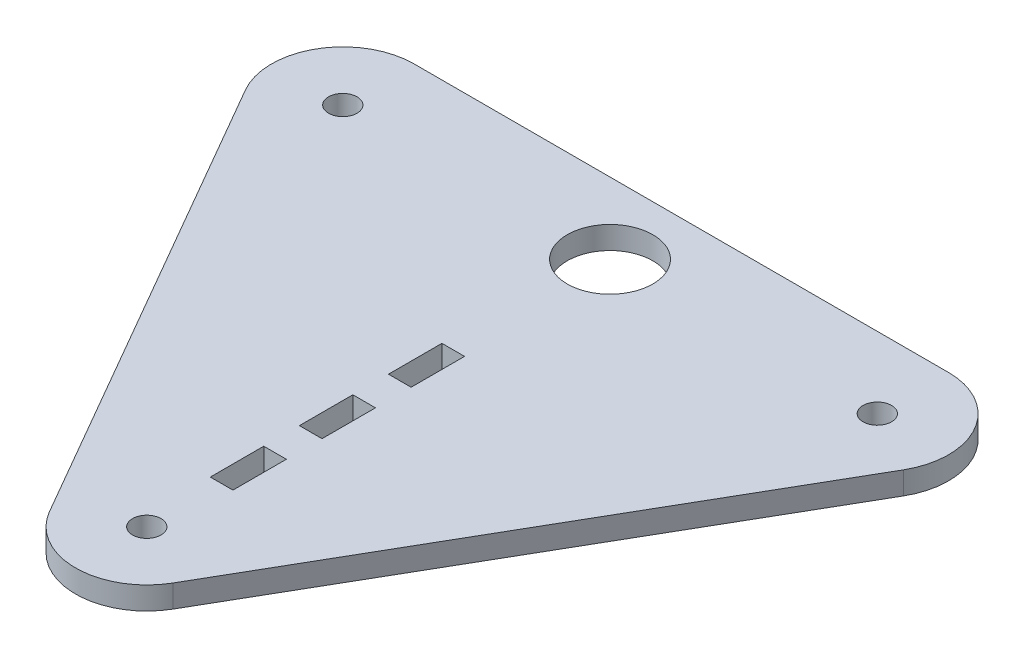
ISO-10303-21;
HEADER;
FILE_DESCRIPTION(('STEP AP214'),'2;1');
FILE_NAME('part.step','',(''),(''),'','','');
FILE_SCHEMA(('AUTOMOTIVE_DESIGN { 1 0 10303 214 1 1 1 1 }'));
ENDSEC;
DATA;
#1=APPLICATION_CONTEXT('core data for automotive mechanical design processes');
#2=APPLICATION_PROTOCOL_DEFINITION('international standard','automotive_design',2000,#1);
#3=PRODUCT_CONTEXT('',#1,'mechanical');
#4=PRODUCT('Part','Part','',(#3));
#5=PRODUCT_RELATED_PRODUCT_CATEGORY('part','',(#4));
#6=PRODUCT_DEFINITION_FORMATION('','',#4);
#7=PRODUCT_DEFINITION_CONTEXT('part definition',#1,'design');
#8=PRODUCT_DEFINITION('design','',#6,#7);
#9=PRODUCT_DEFINITION_SHAPE('','',#8);
#10=(LENGTH_UNIT() NAMED_UNIT(*) SI_UNIT(.MILLI.,.METRE.));
#11=(NAMED_UNIT(*) PLANE_ANGLE_UNIT() SI_UNIT($,.RADIAN.));
#12=(NAMED_UNIT(*) SI_UNIT($,.STERADIAN.) SOLID_ANGLE_UNIT());
#13=UNCERTAINTY_MEASURE_WITH_UNIT(LENGTH_MEASURE(1.E-05),#10,'distance_accuracy_value','');
#14=(GEOMETRIC_REPRESENTATION_CONTEXT(3) GLOBAL_UNCERTAINTY_ASSIGNED_CONTEXT((#13)) GLOBAL_UNIT_ASSIGNED_CONTEXT((#10,
#11,#12)) REPRESENTATION_CONTEXT('',''));
#15=CARTESIAN_POINT('',(0.,0.,0.));
#16=DIRECTION('',(0.,0.,1.));
#17=DIRECTION('',(1.,0.,0.));
#18=AXIS2_PLACEMENT_3D('',#15,#16,#17);
#19=CARTESIAN_POINT('',(75.,6.35,-65.));
#20=DIRECTION('',(0.,1.,0.));
#21=DIRECTION('',(0.,0.,1.));
#22=AXIS2_PLACEMENT_3D('',#19,#20,#21);
#23=PLANE('',#22);
#24=CARTESIAN_POINT('',(0.,6.35,-65.));
#25=DIRECTION('',(0.,1.,0.));
#26=DIRECTION('',(0.,0.,1.));
#27=AXIS2_PLACEMENT_3D('',#24,#25,#26);
#28=CIRCLE('',#27,12.);
#29=CARTESIAN_POINT('',(0.,6.35,-53.));
#30=VERTEX_POINT('',#29);
#31=EDGE_CURVE('E250',#30,#30,#28,.T.);
#32=ORIENTED_EDGE('',*,*,#31,.F.);
#33=EDGE_LOOP('',(#32));
#34=FACE_BOUND('',#33,.T.);
#35=DIRECTION('',(0.,0.,-1.));
#36=VECTOR('',#35,1.);
#37=CARTESIAN_POINT('',(3.175,6.35,29.));
#38=LINE('',#37,#36);
#39=CARTESIAN_POINT('',(3.175,6.35,44.));
#40=VERTEX_POINT('',#39);
#41=CARTESIAN_POINT('',(3.175,6.35,29.));
#42=VERTEX_POINT('',#41);
#43=EDGE_CURVE('E114',#40,#42,#38,.T.);
#44=ORIENTED_EDGE('',*,*,#43,.F.);
#45=DIRECTION('',(1.,0.,0.));
#46=VECTOR('',#45,1.);
#47=CARTESIAN_POINT('',(-3.17499999999999,6.35,44.));
#48=LINE('',#47,#46);
#49=CARTESIAN_POINT('',(-3.17499999999999,6.35,44.));
#50=VERTEX_POINT('',#49);
#51=EDGE_CURVE('E271',#50,#40,#48,.T.);
#52=ORIENTED_EDGE('',*,*,#51,.F.);
#53=DIRECTION('',(0.,0.,1.));
#54=VECTOR('',#53,1.);
#55=CARTESIAN_POINT('',(-3.175,6.35,29.));
#56=LINE('',#55,#54);
#57=CARTESIAN_POINT('',(-3.175,6.35,29.));
#58=VERTEX_POINT('',#57);
#59=EDGE_CURVE('E286',#58,#50,#56,.T.);
#60=ORIENTED_EDGE('',*,*,#59,.F.);
#61=DIRECTION('',(-1.,0.,0.));
#62=VECTOR('',#61,1.);
#63=CARTESIAN_POINT('',(-3.175,6.35,29.));
#64=LINE('',#63,#62);
#65=EDGE_CURVE('E282',#42,#58,#64,.T.);
#66=ORIENTED_EDGE('',*,*,#65,.F.);
#67=EDGE_LOOP('',(#44,#52,#60,#66));
#68=FACE_BOUND('',#67,.T.);
#69=DIRECTION('',(0.,0.,1.));
#70=VECTOR('',#69,1.);
#71=CARTESIAN_POINT('',(-3.175,6.35,-21.));
#72=LINE('',#71,#70);
#73=CARTESIAN_POINT('',(-3.175,6.35,-21.));
#74=VERTEX_POINT('',#73);
#75=CARTESIAN_POINT('',(-3.175,6.35,-6.00000000000001));
#76=VERTEX_POINT('',#75);
#77=EDGE_CURVE('E122',#74,#76,#72,.T.);
#78=ORIENTED_EDGE('',*,*,#77,.F.);
#79=DIRECTION('',(-1.,0.,0.));
#80=VECTOR('',#79,1.);
#81=CARTESIAN_POINT('',(3.175,6.35,-21.));
#82=LINE('',#81,#80);
#83=CARTESIAN_POINT('',(3.175,6.35,-21.));
#84=VERTEX_POINT('',#83);
#85=EDGE_CURVE('E244',#84,#74,#82,.T.);
#86=ORIENTED_EDGE('',*,*,#85,.F.);
#87=DIRECTION('',(0.,0.,-1.));
#88=VECTOR('',#87,1.);
#89=CARTESIAN_POINT('',(3.175,6.35,-21.));
#90=LINE('',#89,#88);
#91=CARTESIAN_POINT('',(3.175,6.35,-6.));
#92=VERTEX_POINT('',#91);
#93=EDGE_CURVE('E247',#92,#84,#90,.T.);
#94=ORIENTED_EDGE('',*,*,#93,.F.);
#95=DIRECTION('',(1.,0.,0.));
#96=VECTOR('',#95,1.);
#97=CARTESIAN_POINT('',(3.175,6.35,-6.));
#98=LINE('',#97,#96);
#99=EDGE_CURVE('E256',#76,#92,#98,.T.);
#100=ORIENTED_EDGE('',*,*,#99,.F.);
#101=EDGE_LOOP('',(#78,#86,#94,#100));
#102=FACE_BOUND('',#101,.T.);
#103=DIRECTION('',(0.,0.,-1.));
#104=VECTOR('',#103,1.);
#105=CARTESIAN_POINT('',(3.175,6.35,4.));
#106=LINE('',#105,#104);
#107=CARTESIAN_POINT('',(3.175,6.35,19.));
#108=VERTEX_POINT('',#107);
#109=CARTESIAN_POINT('',(3.175,6.35,4.));
#110=VERTEX_POINT('',#109);
#111=EDGE_CURVE('E263',#108,#110,#106,.T.);
#112=ORIENTED_EDGE('',*,*,#111,.F.);
#113=DIRECTION('',(1.,0.,0.));
#114=VECTOR('',#113,1.);
#115=CARTESIAN_POINT('',(-3.175,6.35,19.));
#116=LINE('',#115,#114);
#117=CARTESIAN_POINT('',(-3.175,6.35,19.));
#118=VERTEX_POINT('',#117);
#119=EDGE_CURVE('E301',#118,#108,#116,.T.);
#120=ORIENTED_EDGE('',*,*,#119,.F.);
#121=DIRECTION('',(0.,0.,1.));
#122=VECTOR('',#121,1.);
#123=CARTESIAN_POINT('',(-3.175,6.35,4.));
#124=LINE('',#123,#122);
#125=CARTESIAN_POINT('',(-3.175,6.35,4.));
#126=VERTEX_POINT('',#125);
#127=EDGE_CURVE('E315',#126,#118,#124,.T.);
#128=ORIENTED_EDGE('',*,*,#127,.F.);
#129=DIRECTION('',(-1.,0.,0.));
#130=VECTOR('',#129,1.);
#131=CARTESIAN_POINT('',(-3.175,6.35,4.));
#132=LINE('',#131,#130);
#133=EDGE_CURVE('E312',#110,#126,#132,.T.);
#134=ORIENTED_EDGE('',*,*,#133,.F.);
#135=EDGE_LOOP('',(#112,#120,#128,#134));
#136=FACE_BOUND('',#135,.T.);
#137=CARTESIAN_POINT('',(75.,6.35,-65.));
#138=DIRECTION('',(0.,1.,0.));
#139=DIRECTION('',(0.,0.,1.));
#140=AXIS2_PLACEMENT_3D('',#137,#138,#139);
#141=CIRCLE('',#140,4.00000000000001);
#142=CARTESIAN_POINT('',(75.,6.35,-61.));
#143=VERTEX_POINT('',#142);
#144=EDGE_CURVE('E335',#143,#143,#141,.T.);
#145=ORIENTED_EDGE('',*,*,#144,.F.);
#146=EDGE_LOOP('',(#145));
#147=FACE_BOUND('',#146,.T.);
#148=CARTESIAN_POINT('',(75.,6.35,-65.));
#149=DIRECTION('',(0.,1.,0.));
#150=DIRECTION('',(0.,0.,1.));
#151=AXIS2_PLACEMENT_3D('',#148,#149,#150);
#152=CIRCLE('',#151,20.);
#153=CARTESIAN_POINT('',(92.323711720972,6.35,-55.0055509302085));
#154=VERTEX_POINT('',#153);
#155=CARTESIAN_POINT('',(75.,6.35,-85.));
#156=VERTEX_POINT('',#155);
#157=EDGE_CURVE('E347',#154,#156,#152,.T.);
#158=ORIENTED_EDGE('',*,*,#157,.T.);
#159=DIRECTION('',(1.,0.,0.));
#160=VECTOR('',#159,1.);
#161=CARTESIAN_POINT('',(-75.,6.35,-85.));
#162=LINE('',#161,#160);
#163=CARTESIAN_POINT('',(-75.,6.35,-85.));
#164=VERTEX_POINT('',#163);
#165=EDGE_CURVE('E349',#164,#156,#162,.T.);
#166=ORIENTED_EDGE('',*,*,#165,.F.);
#167=CARTESIAN_POINT('',(-75.,6.35,-65.));
#168=DIRECTION('',(0.,1.,0.));
#169=DIRECTION('',(0.,0.,1.));
#170=AXIS2_PLACEMENT_3D('',#167,#168,#169);
#171=CIRCLE('',#170,20.);
#172=CARTESIAN_POINT('',(-92.323711720972,6.35,-55.0055509302085));
#173=VERTEX_POINT('',#172);
#174=EDGE_CURVE('E353',#164,#173,#171,.T.);
#175=ORIENTED_EDGE('',*,*,#174,.T.);
#176=DIRECTION('',(0.499722453489577,0.,0.8661855860486));
#177=VECTOR('',#176,1.);
#178=CARTESIAN_POINT('',(-92.323711720972,6.35,-55.0055509302085));
#179=LINE('',#178,#177);
#180=CARTESIAN_POINT('',(-17.323711720972,6.35,74.9944490697916));
#181=VERTEX_POINT('',#180);
#182=EDGE_CURVE('E355',#173,#181,#179,.T.);
#183=ORIENTED_EDGE('',*,*,#182,.T.);
#184=CARTESIAN_POINT('',(0.,6.35,65.));
#185=DIRECTION('',(0.,1.,0.));
#186=DIRECTION('',(0.,0.,1.));
#187=AXIS2_PLACEMENT_3D('',#184,#185,#186);
#188=CIRCLE('',#187,20.);
#189=CARTESIAN_POINT('',(17.323711720972,6.35,74.9944490697916));
#190=VERTEX_POINT('',#189);
#191=EDGE_CURVE('E357',#181,#190,#188,.T.);
#192=ORIENTED_EDGE('',*,*,#191,.T.);
#193=DIRECTION('',(-0.499722453489577,0.,0.8661855860486));
#194=VECTOR('',#193,1.);
#195=CARTESIAN_POINT('',(92.323711720972,6.35,-55.0055509302085));
#196=LINE('',#195,#194);
#197=EDGE_CURVE('E359',#154,#190,#196,.T.);
#198=ORIENTED_EDGE('',*,*,#197,.F.);
#199=EDGE_LOOP('',(#158,#166,#175,#183,#192,#198));
#200=FACE_BOUND('',#199,.T.);
#201=CARTESIAN_POINT('',(0.,6.35,65.));
#202=DIRECTION('',(0.,1.,0.));
#203=DIRECTION('',(0.,0.,1.));
#204=AXIS2_PLACEMENT_3D('',#201,#202,#203);
#205=CIRCLE('',#204,4.);
#206=CARTESIAN_POINT('',(0.,6.35,69.));
#207=VERTEX_POINT('',#206);
#208=EDGE_CURVE('E341',#207,#207,#205,.T.);
#209=ORIENTED_EDGE('',*,*,#208,.F.);
#210=EDGE_LOOP('',(#209));
#211=FACE_BOUND('',#210,.T.);
#212=CARTESIAN_POINT('',(-75.,6.35,-65.));
#213=DIRECTION('',(0.,1.,0.));
#214=DIRECTION('',(0.,0.,1.));
#215=AXIS2_PLACEMENT_3D('',#212,#213,#214);
#216=CIRCLE('',#215,4.00000000000001);
#217=CARTESIAN_POINT('',(-75.,6.35,-61.));
#218=VERTEX_POINT('',#217);
#219=EDGE_CURVE('E329',#218,#218,#216,.T.);
#220=ORIENTED_EDGE('',*,*,#219,.F.);
#221=EDGE_LOOP('',(#220));
#222=FACE_BOUND('',#221,.T.);
#223=ADVANCED_FACE('F99',(#34,#68,#102,#136,#147,#200,#211,#222),#23,.T.);
#224=CARTESIAN_POINT('',(75.,0.,-65.));
#225=DIRECTION('',(0.,1.,0.));
#226=DIRECTION('',(0.,0.,1.));
#227=AXIS2_PLACEMENT_3D('',#224,#225,#226);
#228=PLANE('',#227);
#229=CARTESIAN_POINT('',(0.,0.,-65.));
#230=DIRECTION('',(0.,1.,0.));
#231=DIRECTION('',(0.,0.,1.));
#232=AXIS2_PLACEMENT_3D('',#229,#230,#231);
#233=CIRCLE('',#232,12.);
#234=CARTESIAN_POINT('',(0.,0.,-53.));
#235=VERTEX_POINT('',#234);
#236=EDGE_CURVE('E283',#235,#235,#233,.T.);
#237=ORIENTED_EDGE('',*,*,#236,.T.);
#238=EDGE_LOOP('',(#237));
#239=FACE_BOUND('',#238,.T.);
#240=DIRECTION('',(1.,0.,0.));
#241=VECTOR('',#240,1.);
#242=CARTESIAN_POINT('',(-3.17499999999999,0.,44.));
#243=LINE('',#242,#241);
#244=CARTESIAN_POINT('',(-3.17499999999999,0.,44.));
#245=VERTEX_POINT('',#244);
#246=CARTESIAN_POINT('',(3.175,0.,44.));
#247=VERTEX_POINT('',#246);
#248=EDGE_CURVE('E277',#245,#247,#243,.T.);
#249=ORIENTED_EDGE('',*,*,#248,.T.);
#250=DIRECTION('',(0.,0.,-1.));
#251=VECTOR('',#250,1.);
#252=CARTESIAN_POINT('',(3.175,0.,29.));
#253=LINE('',#252,#251);
#254=CARTESIAN_POINT('',(3.175,0.,29.));
#255=VERTEX_POINT('',#254);
#256=EDGE_CURVE('E267',#247,#255,#253,.T.);
#257=ORIENTED_EDGE('',*,*,#256,.T.);
#258=DIRECTION('',(-1.,0.,0.));
#259=VECTOR('',#258,1.);
#260=CARTESIAN_POINT('',(-3.175,0.,29.));
#261=LINE('',#260,#259);
#262=CARTESIAN_POINT('',(-3.175,0.,29.));
#263=VERTEX_POINT('',#262);
#264=EDGE_CURVE('E270',#255,#263,#261,.T.);
#265=ORIENTED_EDGE('',*,*,#264,.T.);
#266=DIRECTION('',(0.,0.,1.));
#267=VECTOR('',#266,1.);
#268=CARTESIAN_POINT('',(-3.175,0.,29.));
#269=LINE('',#268,#267);
#270=EDGE_CURVE('E274',#263,#245,#269,.T.);
#271=ORIENTED_EDGE('',*,*,#270,.T.);
#272=EDGE_LOOP('',(#249,#257,#265,#271));
#273=FACE_BOUND('',#272,.T.);
#274=DIRECTION('',(-1.,0.,0.));
#275=VECTOR('',#274,1.);
#276=CARTESIAN_POINT('',(3.175,0.,-21.));
#277=LINE('',#276,#275);
#278=CARTESIAN_POINT('',(3.175,0.,-21.));
#279=VERTEX_POINT('',#278);
#280=CARTESIAN_POINT('',(-3.175,0.,-21.));
#281=VERTEX_POINT('',#280);
#282=EDGE_CURVE('E231',#279,#281,#277,.T.);
#283=ORIENTED_EDGE('',*,*,#282,.T.);
#284=DIRECTION('',(0.,0.,1.));
#285=VECTOR('',#284,1.);
#286=CARTESIAN_POINT('',(-3.175,0.,-21.));
#287=LINE('',#286,#285);
#288=CARTESIAN_POINT('',(-3.175,0.,-6.));
#289=VERTEX_POINT('',#288);
#290=EDGE_CURVE('E225',#281,#289,#287,.T.);
#291=ORIENTED_EDGE('',*,*,#290,.T.);
#292=DIRECTION('',(1.,0.,0.));
#293=VECTOR('',#292,1.);
#294=CARTESIAN_POINT('',(3.175,0.,-6.));
#295=LINE('',#294,#293);
#296=CARTESIAN_POINT('',(3.175,0.,-6.00000000000001));
#297=VERTEX_POINT('',#296);
#298=EDGE_CURVE('E235',#289,#297,#295,.T.);
#299=ORIENTED_EDGE('',*,*,#298,.T.);
#300=DIRECTION('',(0.,0.,-1.));
#301=VECTOR('',#300,1.);
#302=CARTESIAN_POINT('',(3.175,0.,-21.));
#303=LINE('',#302,#301);
#304=EDGE_CURVE('E239',#297,#279,#303,.T.);
#305=ORIENTED_EDGE('',*,*,#304,.T.);
#306=EDGE_LOOP('',(#283,#291,#299,#305));
#307=FACE_BOUND('',#306,.T.);
#308=DIRECTION('',(1.,0.,0.));
#309=VECTOR('',#308,1.);
#310=CARTESIAN_POINT('',(-3.175,0.,19.));
#311=LINE('',#310,#309);
#312=CARTESIAN_POINT('',(-3.175,0.,19.));
#313=VERTEX_POINT('',#312);
#314=CARTESIAN_POINT('',(3.175,0.,19.));
#315=VERTEX_POINT('',#314);
#316=EDGE_CURVE('E307',#313,#315,#311,.T.);
#317=ORIENTED_EDGE('',*,*,#316,.T.);
#318=DIRECTION('',(0.,0.,-1.));
#319=VECTOR('',#318,1.);
#320=CARTESIAN_POINT('',(3.175,0.,4.));
#321=LINE('',#320,#319);
#322=CARTESIAN_POINT('',(3.175,0.,4.));
#323=VERTEX_POINT('',#322);
#324=EDGE_CURVE('E297',#315,#323,#321,.T.);
#325=ORIENTED_EDGE('',*,*,#324,.T.);
#326=DIRECTION('',(-1.,0.,0.));
#327=VECTOR('',#326,1.);
#328=CARTESIAN_POINT('',(-3.175,0.,4.));
#329=LINE('',#328,#327);
#330=CARTESIAN_POINT('',(-3.175,0.,4.));
#331=VERTEX_POINT('',#330);
#332=EDGE_CURVE('E300',#323,#331,#329,.T.);
#333=ORIENTED_EDGE('',*,*,#332,.T.);
#334=DIRECTION('',(0.,0.,1.));
#335=VECTOR('',#334,1.);
#336=CARTESIAN_POINT('',(-3.175,0.,4.));
#337=LINE('',#336,#335);
#338=EDGE_CURVE('E304',#331,#313,#337,.T.);
#339=ORIENTED_EDGE('',*,*,#338,.T.);
#340=EDGE_LOOP('',(#317,#325,#333,#339));
#341=FACE_BOUND('',#340,.T.);
#342=CARTESIAN_POINT('',(75.,0.,-65.));
#343=DIRECTION('',(0.,1.,0.));
#344=DIRECTION('',(0.,0.,1.));
#345=AXIS2_PLACEMENT_3D('',#342,#343,#344);
#346=CIRCLE('',#345,20.);
#347=CARTESIAN_POINT('',(92.323711720972,0.,-55.0055509302085));
#348=VERTEX_POINT('',#347);
#349=CARTESIAN_POINT('',(75.,0.,-85.));
#350=VERTEX_POINT('',#349);
#351=EDGE_CURVE('E344',#348,#350,#346,.T.);
#352=ORIENTED_EDGE('',*,*,#351,.F.);
#353=DIRECTION('',(-0.499722453489577,0.,0.8661855860486));
#354=VECTOR('',#353,1.);
#355=CARTESIAN_POINT('',(92.323711720972,0.,-55.0055509302085));
#356=LINE('',#355,#354);
#357=CARTESIAN_POINT('',(17.323711720972,0.,74.9944490697916));
#358=VERTEX_POINT('',#357);
#359=EDGE_CURVE('E350',#348,#358,#356,.T.);
#360=ORIENTED_EDGE('',*,*,#359,.T.);
#361=CARTESIAN_POINT('',(0.,0.,65.));
#362=DIRECTION('',(0.,1.,0.));
#363=DIRECTION('',(0.,0.,1.));
#364=AXIS2_PLACEMENT_3D('',#361,#362,#363);
#365=CIRCLE('',#364,20.);
#366=CARTESIAN_POINT('',(-17.323711720972,0.,74.9944490697916));
#367=VERTEX_POINT('',#366);
#368=EDGE_CURVE('E372',#367,#358,#365,.T.);
#369=ORIENTED_EDGE('',*,*,#368,.F.);
#370=DIRECTION('',(0.499722453489577,0.,0.8661855860486));
#371=VECTOR('',#370,1.);
#372=CARTESIAN_POINT('',(-92.323711720972,0.,-55.0055509302085));
#373=LINE('',#372,#371);
#374=CARTESIAN_POINT('',(-92.323711720972,0.,-55.0055509302085));
#375=VERTEX_POINT('',#374);
#376=EDGE_CURVE('E370',#375,#367,#373,.T.);
#377=ORIENTED_EDGE('',*,*,#376,.F.);
#378=CARTESIAN_POINT('',(-75.,0.,-65.));
#379=DIRECTION('',(0.,1.,0.));
#380=DIRECTION('',(0.,0.,1.));
#381=AXIS2_PLACEMENT_3D('',#378,#379,#380);
#382=CIRCLE('',#381,20.);
#383=CARTESIAN_POINT('',(-75.,0.,-85.));
#384=VERTEX_POINT('',#383);
#385=EDGE_CURVE('E368',#384,#375,#382,.T.);
#386=ORIENTED_EDGE('',*,*,#385,.F.);
#387=DIRECTION('',(1.,0.,0.));
#388=VECTOR('',#387,1.);
#389=CARTESIAN_POINT('',(-75.,0.,-85.));
#390=LINE('',#389,#388);
#391=EDGE_CURVE('E365',#384,#350,#390,.T.);
#392=ORIENTED_EDGE('',*,*,#391,.T.);
#393=EDGE_LOOP('',(#352,#360,#369,#377,#386,#392));
#394=FACE_BOUND('',#393,.T.);
#395=CARTESIAN_POINT('',(0.,0.,65.));
#396=DIRECTION('',(0.,1.,0.));
#397=DIRECTION('',(0.,0.,1.));
#398=AXIS2_PLACEMENT_3D('',#395,#396,#397);
#399=CIRCLE('',#398,4.);
#400=CARTESIAN_POINT('',(0.,0.,69.));
#401=VERTEX_POINT('',#400);
#402=EDGE_CURVE('E338',#401,#401,#399,.T.);
#403=ORIENTED_EDGE('',*,*,#402,.T.);
#404=EDGE_LOOP('',(#403));
#405=FACE_BOUND('',#404,.T.);
#406=CARTESIAN_POINT('',(75.,0.,-65.));
#407=DIRECTION('',(0.,1.,0.));
#408=DIRECTION('',(0.,0.,1.));
#409=AXIS2_PLACEMENT_3D('',#406,#407,#408);
#410=CIRCLE('',#409,4.00000000000001);
#411=CARTESIAN_POINT('',(75.,0.,-61.));
#412=VERTEX_POINT('',#411);
#413=EDGE_CURVE('E332',#412,#412,#410,.T.);
#414=ORIENTED_EDGE('',*,*,#413,.T.);
#415=EDGE_LOOP('',(#414));
#416=FACE_BOUND('',#415,.T.);
#417=CARTESIAN_POINT('',(-75.,0.,-65.));
#418=DIRECTION('',(0.,1.,0.));
#419=DIRECTION('',(0.,0.,1.));
#420=AXIS2_PLACEMENT_3D('',#417,#418,#419);
#421=CIRCLE('',#420,4.00000000000001);
#422=CARTESIAN_POINT('',(-75.,0.,-61.));
#423=VERTEX_POINT('',#422);
#424=EDGE_CURVE('E322',#423,#423,#421,.T.);
#425=ORIENTED_EDGE('',*,*,#424,.T.);
#426=EDGE_LOOP('',(#425));
#427=FACE_BOUND('',#426,.T.);
#428=ADVANCED_FACE('F241',(#239,#273,#307,#341,#394,#405,#416,#427),#228,.F.);
#429=CARTESIAN_POINT('',(75.,6.35,-65.));
#430=DIRECTION('',(0.,-1.,0.));
#431=DIRECTION('',(0.,0.,-1.));
#432=AXIS2_PLACEMENT_3D('',#429,#430,#431);
#433=CYLINDRICAL_SURFACE('',#432,20.);
#434=ORIENTED_EDGE('',*,*,#351,.T.);
#435=DIRECTION('',(0.,-1.,0.));
#436=VECTOR('',#435,1.);
#437=CARTESIAN_POINT('',(75.,6.35,-85.));
#438=LINE('',#437,#436);
#439=EDGE_CURVE('E12',#156,#350,#438,.T.);
#440=ORIENTED_EDGE('',*,*,#439,.F.);
#441=ORIENTED_EDGE('',*,*,#157,.F.);
#442=DIRECTION('',(0.,-1.,0.));
#443=VECTOR('',#442,1.);
#444=CARTESIAN_POINT('',(92.323711720972,6.35,-55.0055509302085));
#445=LINE('',#444,#443);
#446=EDGE_CURVE('E362',#154,#348,#445,.T.);
#447=ORIENTED_EDGE('',*,*,#446,.T.);
#448=EDGE_LOOP('',(#434,#440,#441,#447));
#449=FACE_BOUND('',#448,.T.);
#450=ADVANCED_FACE('F101',(#449),#433,.T.);
#451=CARTESIAN_POINT('',(-75.,6.35,-85.));
#452=DIRECTION('',(0.,0.,-1.));
#453=DIRECTION('',(-1.,0.,0.));
#454=AXIS2_PLACEMENT_3D('',#451,#452,#453);
#455=PLANE('',#454);
#456=ORIENTED_EDGE('',*,*,#391,.F.);
#457=DIRECTION('',(0.,-1.,0.));
#458=VECTOR('',#457,1.);
#459=CARTESIAN_POINT('',(-75.,6.35,-85.));
#460=LINE('',#459,#458);
#461=EDGE_CURVE('E107',#164,#384,#460,.T.);
#462=ORIENTED_EDGE('',*,*,#461,.F.);
#463=ORIENTED_EDGE('',*,*,#165,.T.);
#464=ORIENTED_EDGE('',*,*,#439,.T.);
#465=EDGE_LOOP('',(#456,#462,#463,#464));
#466=FACE_BOUND('',#465,.T.);
#467=ADVANCED_FACE('F398',(#466),#455,.T.);
#468=CARTESIAN_POINT('',(-75.,6.35,-65.));
#469=DIRECTION('',(0.,-1.,0.));
#470=DIRECTION('',(0.,0.,-1.));
#471=AXIS2_PLACEMENT_3D('',#468,#469,#470);
#472=CYLINDRICAL_SURFACE('',#471,20.);
#473=ORIENTED_EDGE('',*,*,#385,.T.);
#474=DIRECTION('',(0.,-1.,0.));
#475=VECTOR('',#474,1.);
#476=CARTESIAN_POINT('',(-92.323711720972,6.35,-55.0055509302085));
#477=LINE('',#476,#475);
#478=EDGE_CURVE('E383',#173,#375,#477,.T.);
#479=ORIENTED_EDGE('',*,*,#478,.F.);
#480=ORIENTED_EDGE('',*,*,#174,.F.);
#481=ORIENTED_EDGE('',*,*,#461,.T.);
#482=EDGE_LOOP('',(#473,#479,#480,#481));
#483=FACE_BOUND('',#482,.T.);
#484=ADVANCED_FACE('F388',(#483),#472,.T.);
#485=CARTESIAN_POINT('',(-92.323711720972,6.35,-55.0055509302085));
#486=DIRECTION('',(0.8661855860486,0.,-0.499722453489577));
#487=DIRECTION('',(-0.499722453489577,0.,-0.8661855860486));
#488=AXIS2_PLACEMENT_3D('',#485,#486,#487);
#489=PLANE('',#488);
#490=ORIENTED_EDGE('',*,*,#376,.T.);
#491=DIRECTION('',(0.,-1.,0.));
#492=VECTOR('',#491,1.);
#493=CARTESIAN_POINT('',(-17.323711720972,6.35,74.9944490697916));
#494=LINE('',#493,#492);
#495=EDGE_CURVE('E380',#181,#367,#494,.T.);
#496=ORIENTED_EDGE('',*,*,#495,.F.);
#497=ORIENTED_EDGE('',*,*,#182,.F.);
#498=ORIENTED_EDGE('',*,*,#478,.T.);
#499=EDGE_LOOP('',(#490,#496,#497,#498));
#500=FACE_BOUND('',#499,.T.);
#501=ADVANCED_FACE('F413',(#500),#489,.F.);
#502=CARTESIAN_POINT('',(0.,6.35,65.));
#503=DIRECTION('',(0.,-1.,0.));
#504=DIRECTION('',(0.,0.,-1.));
#505=AXIS2_PLACEMENT_3D('',#502,#503,#504);
#506=CYLINDRICAL_SURFACE('',#505,20.);
#507=ORIENTED_EDGE('',*,*,#368,.T.);
#508=DIRECTION('',(0.,-1.,0.));
#509=VECTOR('',#508,1.);
#510=CARTESIAN_POINT('',(17.323711720972,6.35,74.9944490697916));
#511=LINE('',#510,#509);
#512=EDGE_CURVE('E378',#190,#358,#511,.T.);
#513=ORIENTED_EDGE('',*,*,#512,.F.);
#514=ORIENTED_EDGE('',*,*,#191,.F.);
#515=ORIENTED_EDGE('',*,*,#495,.T.);
#516=EDGE_LOOP('',(#507,#513,#514,#515));
#517=FACE_BOUND('',#516,.T.);
#518=ADVANCED_FACE('F409',(#517),#506,.T.);
#519=CARTESIAN_POINT('',(92.323711720972,6.35,-55.0055509302085));
#520=DIRECTION('',(0.8661855860486,0.,0.499722453489577));
#521=DIRECTION('',(0.499722453489577,0.,-0.8661855860486));
#522=AXIS2_PLACEMENT_3D('',#519,#520,#521);
#523=PLANE('',#522);
#524=ORIENTED_EDGE('',*,*,#359,.F.);
#525=ORIENTED_EDGE('',*,*,#446,.F.);
#526=ORIENTED_EDGE('',*,*,#197,.T.);
#527=ORIENTED_EDGE('',*,*,#512,.T.);
#528=EDGE_LOOP('',(#524,#525,#526,#527));
#529=FACE_BOUND('',#528,.T.);
#530=ADVANCED_FACE('F404',(#529),#523,.T.);
#531=CARTESIAN_POINT('',(0.,6.35,65.));
#532=DIRECTION('',(0.,-1.,0.));
#533=DIRECTION('',(0.,0.,-1.));
#534=AXIS2_PLACEMENT_3D('',#531,#532,#533);
#535=CYLINDRICAL_SURFACE('',#534,4.);
#536=ORIENTED_EDGE('',*,*,#208,.T.);
#537=EDGE_LOOP('',(#536));
#538=FACE_BOUND('',#537,.T.);
#539=ORIENTED_EDGE('',*,*,#402,.F.);
#540=EDGE_LOOP('',(#539));
#541=FACE_BOUND('',#540,.T.);
#542=ADVANCED_FACE('F443',(#538,#541),#535,.F.);
#543=CARTESIAN_POINT('',(75.,6.35,-65.));
#544=DIRECTION('',(0.,-1.,0.));
#545=DIRECTION('',(0.,0.,-1.));
#546=AXIS2_PLACEMENT_3D('',#543,#544,#545);
#547=CYLINDRICAL_SURFACE('',#546,4.00000000000001);
#548=ORIENTED_EDGE('',*,*,#144,.T.);
#549=EDGE_LOOP('',(#548));
#550=FACE_BOUND('',#549,.T.);
#551=ORIENTED_EDGE('',*,*,#413,.F.);
#552=EDGE_LOOP('',(#551));
#553=FACE_BOUND('',#552,.T.);
#554=ADVANCED_FACE('F427',(#550,#553),#547,.F.);
#555=CARTESIAN_POINT('',(-75.,6.35,-65.));
#556=DIRECTION('',(0.,-1.,0.));
#557=DIRECTION('',(0.,0.,-1.));
#558=AXIS2_PLACEMENT_3D('',#555,#556,#557);
#559=CYLINDRICAL_SURFACE('',#558,4.00000000000001);
#560=ORIENTED_EDGE('',*,*,#219,.T.);
#561=EDGE_LOOP('',(#560));
#562=FACE_BOUND('',#561,.T.);
#563=ORIENTED_EDGE('',*,*,#424,.F.);
#564=EDGE_LOOP('',(#563));
#565=FACE_BOUND('',#564,.T.);
#566=ADVANCED_FACE('F423',(#562,#565),#559,.F.);
#567=CARTESIAN_POINT('',(3.175,0.,4.));
#568=DIRECTION('',(1.,0.,0.));
#569=DIRECTION('',(0.,0.,-1.));
#570=AXIS2_PLACEMENT_3D('',#567,#568,#569);
#571=PLANE('',#570);
#572=ORIENTED_EDGE('',*,*,#111,.T.);
#573=DIRECTION('',(0.,1.,0.));
#574=VECTOR('',#573,1.);
#575=CARTESIAN_POINT('',(3.175,0.,4.));
#576=LINE('',#575,#574);
#577=EDGE_CURVE('E310',#323,#110,#576,.T.);
#578=ORIENTED_EDGE('',*,*,#577,.F.);
#579=ORIENTED_EDGE('',*,*,#324,.F.);
#580=DIRECTION('',(0.,1.,0.));
#581=VECTOR('',#580,1.);
#582=CARTESIAN_POINT('',(3.175,0.,19.));
#583=LINE('',#582,#581);
#584=EDGE_CURVE('E320',#315,#108,#583,.T.);
#585=ORIENTED_EDGE('',*,*,#584,.T.);
#586=EDGE_LOOP('',(#572,#578,#579,#585));
#587=FACE_BOUND('',#586,.T.);
#588=ADVANCED_FACE('F426',(#587),#571,.F.);
#589=CARTESIAN_POINT('',(-3.175,0.,19.));
#590=DIRECTION('',(0.,0.,1.));
#591=DIRECTION('',(1.,0.,0.));
#592=AXIS2_PLACEMENT_3D('',#589,#590,#591);
#593=PLANE('',#592);
#594=ORIENTED_EDGE('',*,*,#119,.T.);
#595=ORIENTED_EDGE('',*,*,#584,.F.);
#596=ORIENTED_EDGE('',*,*,#316,.F.);
#597=DIRECTION('',(0.,1.,0.));
#598=VECTOR('',#597,1.);
#599=CARTESIAN_POINT('',(-3.175,0.,19.));
#600=LINE('',#599,#598);
#601=EDGE_CURVE('E323',#313,#118,#600,.T.);
#602=ORIENTED_EDGE('',*,*,#601,.T.);
#603=EDGE_LOOP('',(#594,#595,#596,#602));
#604=FACE_BOUND('',#603,.T.);
#605=ADVANCED_FACE('F493',(#604),#593,.F.);
#606=CARTESIAN_POINT('',(-3.175,0.,4.));
#607=DIRECTION('',(-1.,0.,0.));
#608=DIRECTION('',(0.,0.,1.));
#609=AXIS2_PLACEMENT_3D('',#606,#607,#608);
#610=PLANE('',#609);
#611=ORIENTED_EDGE('',*,*,#127,.T.);
#612=ORIENTED_EDGE('',*,*,#601,.F.);
#613=ORIENTED_EDGE('',*,*,#338,.F.);
#614=DIRECTION('',(0.,1.,0.));
#615=VECTOR('',#614,1.);
#616=CARTESIAN_POINT('',(-3.175,0.,4.));
#617=LINE('',#616,#615);
#618=EDGE_CURVE('E325',#331,#126,#617,.T.);
#619=ORIENTED_EDGE('',*,*,#618,.T.);
#620=EDGE_LOOP('',(#611,#612,#613,#619));
#621=FACE_BOUND('',#620,.T.);
#622=ADVANCED_FACE('F501',(#621),#610,.F.);
#623=CARTESIAN_POINT('',(-3.175,0.,4.));
#624=DIRECTION('',(0.,0.,-1.));
#625=DIRECTION('',(-1.,0.,0.));
#626=AXIS2_PLACEMENT_3D('',#623,#624,#625);
#627=PLANE('',#626);
#628=ORIENTED_EDGE('',*,*,#133,.T.);
#629=ORIENTED_EDGE('',*,*,#618,.F.);
#630=ORIENTED_EDGE('',*,*,#332,.F.);
#631=ORIENTED_EDGE('',*,*,#577,.T.);
#632=EDGE_LOOP('',(#628,#629,#630,#631));
#633=FACE_BOUND('',#632,.T.);
#634=ADVANCED_FACE('F509',(#633),#627,.F.);
#635=CARTESIAN_POINT('',(-3.175,0.,-21.));
#636=DIRECTION('',(-1.,0.,0.));
#637=DIRECTION('',(0.,0.,1.));
#638=AXIS2_PLACEMENT_3D('',#635,#636,#637);
#639=PLANE('',#638);
#640=ORIENTED_EDGE('',*,*,#77,.T.);
#641=DIRECTION('',(0.,1.,0.));
#642=VECTOR('',#641,1.);
#643=CARTESIAN_POINT('',(-3.175,0.,-6.));
#644=LINE('',#643,#642);
#645=EDGE_CURVE('E221',#289,#76,#644,.T.);
#646=ORIENTED_EDGE('',*,*,#645,.F.);
#647=ORIENTED_EDGE('',*,*,#290,.F.);
#648=DIRECTION('',(0.,1.,0.));
#649=VECTOR('',#648,1.);
#650=CARTESIAN_POINT('',(-3.175,0.,-21.));
#651=LINE('',#650,#649);
#652=EDGE_CURVE('E261',#281,#74,#651,.T.);
#653=ORIENTED_EDGE('',*,*,#652,.T.);
#654=EDGE_LOOP('',(#640,#646,#647,#653));
#655=FACE_BOUND('',#654,.T.);
#656=ADVANCED_FACE('F223',(#655),#639,.F.);
#657=CARTESIAN_POINT('',(3.175,0.,-21.));
#658=DIRECTION('',(0.,0.,-1.));
#659=DIRECTION('',(-1.,0.,0.));
#660=AXIS2_PLACEMENT_3D('',#657,#658,#659);
#661=PLANE('',#660);
#662=ORIENTED_EDGE('',*,*,#85,.T.);
#663=ORIENTED_EDGE('',*,*,#652,.F.);
#664=ORIENTED_EDGE('',*,*,#282,.F.);
#665=DIRECTION('',(0.,1.,0.));
#666=VECTOR('',#665,1.);
#667=CARTESIAN_POINT('',(3.175,0.,-21.));
#668=LINE('',#667,#666);
#669=EDGE_CURVE('E264',#279,#84,#668,.T.);
#670=ORIENTED_EDGE('',*,*,#669,.T.);
#671=EDGE_LOOP('',(#662,#663,#664,#670));
#672=FACE_BOUND('',#671,.T.);
#673=ADVANCED_FACE('F524',(#672),#661,.F.);
#674=CARTESIAN_POINT('',(3.175,0.,-21.));
#675=DIRECTION('',(1.,0.,0.));
#676=DIRECTION('',(0.,0.,-1.));
#677=AXIS2_PLACEMENT_3D('',#674,#675,#676);
#678=PLANE('',#677);
#679=ORIENTED_EDGE('',*,*,#93,.T.);
#680=ORIENTED_EDGE('',*,*,#669,.F.);
#681=ORIENTED_EDGE('',*,*,#304,.F.);
#682=DIRECTION('',(0.,1.,0.));
#683=VECTOR('',#682,1.);
#684=CARTESIAN_POINT('',(3.175,0.,-6.));
#685=LINE('',#684,#683);
#686=EDGE_CURVE('E230',#297,#92,#685,.T.);
#687=ORIENTED_EDGE('',*,*,#686,.T.);
#688=EDGE_LOOP('',(#679,#680,#681,#687));
#689=FACE_BOUND('',#688,.T.);
#690=ADVANCED_FACE('F531',(#689),#678,.F.);
#691=CARTESIAN_POINT('',(3.175,0.,-6.));
#692=DIRECTION('',(0.,0.,1.));
#693=DIRECTION('',(1.,0.,0.));
#694=AXIS2_PLACEMENT_3D('',#691,#692,#693);
#695=PLANE('',#694);
#696=ORIENTED_EDGE('',*,*,#99,.T.);
#697=ORIENTED_EDGE('',*,*,#686,.F.);
#698=ORIENTED_EDGE('',*,*,#298,.F.);
#699=ORIENTED_EDGE('',*,*,#645,.T.);
#700=EDGE_LOOP('',(#696,#697,#698,#699));
#701=FACE_BOUND('',#700,.T.);
#702=ADVANCED_FACE('F236',(#701),#695,.F.);
#703=CARTESIAN_POINT('',(3.175,0.,29.));
#704=DIRECTION('',(1.,0.,0.));
#705=DIRECTION('',(0.,0.,-1.));
#706=AXIS2_PLACEMENT_3D('',#703,#704,#705);
#707=PLANE('',#706);
#708=ORIENTED_EDGE('',*,*,#43,.T.);
#709=DIRECTION('',(0.,1.,0.));
#710=VECTOR('',#709,1.);
#711=CARTESIAN_POINT('',(3.175,0.,29.));
#712=LINE('',#711,#710);
#713=EDGE_CURVE('E280',#255,#42,#712,.T.);
#714=ORIENTED_EDGE('',*,*,#713,.F.);
#715=ORIENTED_EDGE('',*,*,#256,.F.);
#716=DIRECTION('',(0.,1.,0.));
#717=VECTOR('',#716,1.);
#718=CARTESIAN_POINT('',(3.175,0.,44.));
#719=LINE('',#718,#717);
#720=EDGE_CURVE('E257',#247,#40,#719,.T.);
#721=ORIENTED_EDGE('',*,*,#720,.T.);
#722=EDGE_LOOP('',(#708,#714,#715,#721));
#723=FACE_BOUND('',#722,.T.);
#724=ADVANCED_FACE('F546',(#723),#707,.F.);
#725=CARTESIAN_POINT('',(-3.17499999999999,0.,44.));
#726=DIRECTION('',(0.,0.,1.));
#727=DIRECTION('',(1.,0.,0.));
#728=AXIS2_PLACEMENT_3D('',#725,#726,#727);
#729=PLANE('',#728);
#730=ORIENTED_EDGE('',*,*,#51,.T.);
#731=ORIENTED_EDGE('',*,*,#720,.F.);
#732=ORIENTED_EDGE('',*,*,#248,.F.);
#733=DIRECTION('',(0.,1.,0.));
#734=VECTOR('',#733,1.);
#735=CARTESIAN_POINT('',(-3.17499999999999,0.,44.));
#736=LINE('',#735,#734);
#737=EDGE_CURVE('E292',#245,#50,#736,.T.);
#738=ORIENTED_EDGE('',*,*,#737,.T.);
#739=EDGE_LOOP('',(#730,#731,#732,#738));
#740=FACE_BOUND('',#739,.T.);
#741=ADVANCED_FACE('F553',(#740),#729,.F.);
#742=CARTESIAN_POINT('',(-3.175,0.,29.));
#743=DIRECTION('',(-1.,0.,0.));
#744=DIRECTION('',(0.,0.,1.));
#745=AXIS2_PLACEMENT_3D('',#742,#743,#744);
#746=PLANE('',#745);
#747=ORIENTED_EDGE('',*,*,#59,.T.);
#748=ORIENTED_EDGE('',*,*,#737,.F.);
#749=ORIENTED_EDGE('',*,*,#270,.F.);
#750=DIRECTION('',(0.,1.,0.));
#751=VECTOR('',#750,1.);
#752=CARTESIAN_POINT('',(-3.175,0.,29.));
#753=LINE('',#752,#751);
#754=EDGE_CURVE('E294',#263,#58,#753,.T.);
#755=ORIENTED_EDGE('',*,*,#754,.T.);
#756=EDGE_LOOP('',(#747,#748,#749,#755));
#757=FACE_BOUND('',#756,.T.);
#758=ADVANCED_FACE('F560',(#757),#746,.F.);
#759=CARTESIAN_POINT('',(-3.175,0.,29.));
#760=DIRECTION('',(0.,0.,-1.));
#761=DIRECTION('',(-1.,0.,0.));
#762=AXIS2_PLACEMENT_3D('',#759,#760,#761);
#763=PLANE('',#762);
#764=ORIENTED_EDGE('',*,*,#65,.T.);
#765=ORIENTED_EDGE('',*,*,#754,.F.);
#766=ORIENTED_EDGE('',*,*,#264,.F.);
#767=ORIENTED_EDGE('',*,*,#713,.T.);
#768=EDGE_LOOP('',(#764,#765,#766,#767));
#769=FACE_BOUND('',#768,.T.);
#770=ADVANCED_FACE('F568',(#769),#763,.F.);
#771=CARTESIAN_POINT('',(0.,0.,-65.));
#772=DIRECTION('',(0.,1.,0.));
#773=DIRECTION('',(0.,0.,1.));
#774=AXIS2_PLACEMENT_3D('',#771,#772,#773);
#775=CYLINDRICAL_SURFACE('',#774,12.);
#776=ORIENTED_EDGE('',*,*,#236,.F.);
#777=EDGE_LOOP('',(#776));
#778=FACE_BOUND('',#777,.T.);
#779=ORIENTED_EDGE('',*,*,#31,.T.);
#780=EDGE_LOOP('',(#779));
#781=FACE_BOUND('',#780,.T.);
#782=ADVANCED_FACE('F576',(#778,#781),#775,.F.);
#783=CLOSED_SHELL('',(#223,#428,#450,#467,#484,#501,#518,#530,#542,#554,#566,#588,#605,#622,
#634,#656,#673,#690,#702,#724,#741,#758,#770,#782));
#784=MANIFOLD_SOLID_BREP('B2',#783);
#785=ADVANCED_BREP_SHAPE_REPRESENTATION('',(#18,#784),#14);
#786=SHAPE_DEFINITION_REPRESENTATION(#9,#785);
ENDSEC;
END-ISO-10303-21;
